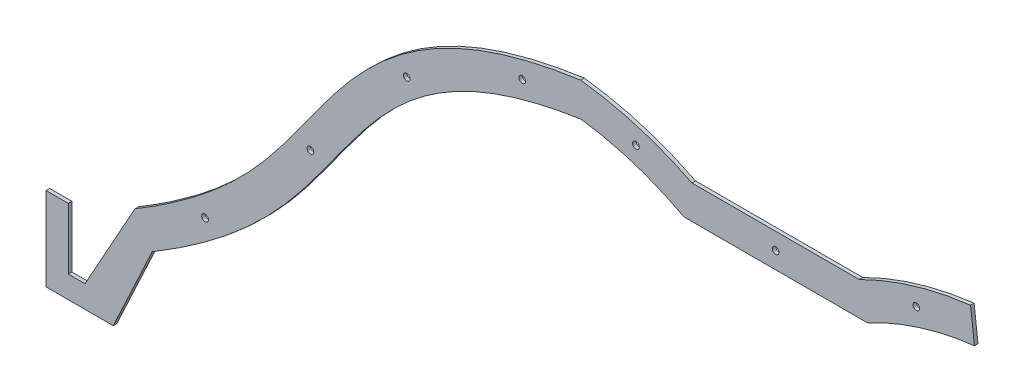
ISO-10303-21;
HEADER;
FILE_DESCRIPTION(('STEP AP214'),'2;1');
FILE_NAME('part.step','',(''),(''),'','','');
FILE_SCHEMA(('AUTOMOTIVE_DESIGN { 1 0 10303 214 1 1 1 1 }'));
ENDSEC;
DATA;
#1=APPLICATION_CONTEXT('core data for automotive mechanical design processes');
#2=APPLICATION_PROTOCOL_DEFINITION('international standard','automotive_design',2000,#1);
#3=PRODUCT_CONTEXT('',#1,'mechanical');
#4=PRODUCT('Part','Part','',(#3));
#5=PRODUCT_RELATED_PRODUCT_CATEGORY('part','',(#4));
#6=PRODUCT_DEFINITION_FORMATION('','',#4);
#7=PRODUCT_DEFINITION_CONTEXT('part definition',#1,'design');
#8=PRODUCT_DEFINITION('design','',#6,#7);
#9=PRODUCT_DEFINITION_SHAPE('','',#8);
#10=(LENGTH_UNIT() NAMED_UNIT(*) SI_UNIT(.MILLI.,.METRE.));
#11=(NAMED_UNIT(*) PLANE_ANGLE_UNIT() SI_UNIT($,.RADIAN.));
#12=(NAMED_UNIT(*) SI_UNIT($,.STERADIAN.) SOLID_ANGLE_UNIT());
#13=UNCERTAINTY_MEASURE_WITH_UNIT(LENGTH_MEASURE(1.E-05),#10,'distance_accuracy_value','');
#14=(GEOMETRIC_REPRESENTATION_CONTEXT(3) GLOBAL_UNCERTAINTY_ASSIGNED_CONTEXT((#13)) GLOBAL_UNIT_ASSIGNED_CONTEXT((#10,
#11,#12)) REPRESENTATION_CONTEXT('',''));
#15=CARTESIAN_POINT('',(0.,0.,0.));
#16=DIRECTION('',(0.,0.,1.));
#17=DIRECTION('',(1.,0.,0.));
#18=AXIS2_PLACEMENT_3D('',#15,#16,#17);
#19=CARTESIAN_POINT('',(-305.730376042937,66.0922491219474,3.175));
#20=DIRECTION('',(0.,0.,-1.));
#21=DIRECTION('',(-1.,0.,0.));
#22=AXIS2_PLACEMENT_3D('',#19,#20,#21);
#23=PLANE('',#22);
#24=CARTESIAN_POINT('',(226.311251147047,174.5053286279,3.175));
#25=DIRECTION('',(0.,0.,1.));
#26=DIRECTION('',(1.,0.,0.));
#27=AXIS2_PLACEMENT_3D('',#24,#25,#26);
#28=CIRCLE('',#27,2.99999999999999);
#29=CARTESIAN_POINT('',(229.311251147047,174.5053286279,3.175));
#30=VERTEX_POINT('',#29);
#31=EDGE_CURVE('E424',#30,#30,#28,.T.);
#32=ORIENTED_EDGE('',*,*,#31,.F.);
#33=EDGE_LOOP('',(#32));
#34=FACE_BOUND('',#33,.T.);
#35=CARTESIAN_POINT('',(-127.411512688745,174.255628939534,3.175));
#36=DIRECTION('',(0.,0.,1.));
#37=DIRECTION('',(1.,0.,0.));
#38=AXIS2_PLACEMENT_3D('',#35,#36,#37);
#39=CIRCLE('',#38,3.00000000000001);
#40=CARTESIAN_POINT('',(-124.411512688745,174.255628939534,3.175));
#41=VERTEX_POINT('',#40);
#42=EDGE_CURVE('E412',#41,#41,#39,.T.);
#43=ORIENTED_EDGE('',*,*,#42,.F.);
#44=EDGE_LOOP('',(#43));
#45=FACE_BOUND('',#44,.T.);
#46=CARTESIAN_POINT('',(-317.601811803088,24.2556289395343,3.175));
#47=DIRECTION('',(0.,0.,1.));
#48=DIRECTION('',(1.,0.,0.));
#49=AXIS2_PLACEMENT_3D('',#46,#47,#48);
#50=CIRCLE('',#49,2.99999999999999);
#51=CARTESIAN_POINT('',(-314.601811803088,24.2556289395343,3.175));
#52=VERTEX_POINT('',#51);
#53=EDGE_CURVE('E400',#52,#52,#50,.T.);
#54=ORIENTED_EDGE('',*,*,#53,.F.);
#55=EDGE_LOOP('',(#54));
#56=FACE_BOUND('',#55,.T.);
#57=CARTESIAN_POINT('',(-75.,200.,3.175));
#58=CARTESIAN_POINT('',(-257.635554762002,174.287094015671,3.175));
#59=CARTESIAN_POINT('',(-306.013905785091,34.0368017017092,3.175));
#60=CARTESIAN_POINT('',(-419.540575808605,-66.8200706837091,3.175));
#61=CARTESIAN_POINT('',(-475.,-100.,3.175));
#62=B_SPLINE_CURVE_WITH_KNOTS('',3,(#57,#58,#59,#60,#61),.UNSPECIFIED.,.F.,.F.,(4,1,4),(0.,
0.687776101030099,1.),.UNSPECIFIED.);
#63=CARTESIAN_POINT('',(-75.0000000000001,200.,3.175));
#64=VERTEX_POINT('',#63);
#65=CARTESIAN_POINT('',(-475.,-100.,3.175));
#66=VERTEX_POINT('',#65);
#67=EDGE_CURVE('E220',#64,#66,#62,.T.);
#68=ORIENTED_EDGE('',*,*,#67,.T.);
#69=DIRECTION('',(-0.48650906414586,-0.873675529303596,0.));
#70=VECTOR('',#69,1.);
#71=CARTESIAN_POINT('',(-519.962766017935,-180.744371060466,3.175));
#72=LINE('',#71,#70);
#73=CARTESIAN_POINT('',(-519.962766017935,-180.744371060466,3.175));
#74=VERTEX_POINT('',#73);
#75=EDGE_CURVE('E118',#66,#74,#72,.T.);
#76=ORIENTED_EDGE('',*,*,#75,.T.);
#77=DIRECTION('',(-1.,0.,0.));
#78=VECTOR('',#77,1.);
#79=CARTESIAN_POINT('',(-534.962766017935,-180.744371060466,3.175));
#80=LINE('',#79,#78);
#81=CARTESIAN_POINT('',(-534.962766017935,-180.744371060466,3.175));
#82=VERTEX_POINT('',#81);
#83=EDGE_CURVE('E259',#74,#82,#80,.T.);
#84=ORIENTED_EDGE('',*,*,#83,.T.);
#85=DIRECTION('',(0.,1.,0.));
#86=VECTOR('',#85,1.);
#87=CARTESIAN_POINT('',(-534.962766017935,-125.744371060466,3.175));
#88=LINE('',#87,#86);
#89=CARTESIAN_POINT('',(-534.962766017935,-125.744371060466,3.175));
#90=VERTEX_POINT('',#89);
#91=EDGE_CURVE('E278',#82,#90,#88,.T.);
#92=ORIENTED_EDGE('',*,*,#91,.T.);
#93=DIRECTION('',(-1.,0.,0.));
#94=VECTOR('',#93,1.);
#95=CARTESIAN_POINT('',(-554.962766017935,-125.744371060466,3.175));
#96=LINE('',#95,#94);
#97=CARTESIAN_POINT('',(-554.962766017935,-125.744371060466,3.175));
#98=VERTEX_POINT('',#97);
#99=EDGE_CURVE('E275',#90,#98,#96,.T.);
#100=ORIENTED_EDGE('',*,*,#99,.T.);
#101=DIRECTION('',(0.,-1.,0.));
#102=VECTOR('',#101,1.);
#103=CARTESIAN_POINT('',(-554.962766017935,-200.744371060466,3.175));
#104=LINE('',#103,#102);
#105=CARTESIAN_POINT('',(-554.962766017935,-200.744371060466,3.175));
#106=VERTEX_POINT('',#105);
#107=EDGE_CURVE('E277',#98,#106,#104,.T.);
#108=ORIENTED_EDGE('',*,*,#107,.T.);
#109=DIRECTION('',(1.,0.,0.));
#110=VECTOR('',#109,1.);
#111=CARTESIAN_POINT('',(-554.962766017935,-200.744371060466,3.175));
#112=LINE('',#111,#110);
#113=CARTESIAN_POINT('',(-494.597813184451,-200.744371060466,3.175));
#114=VERTEX_POINT('',#113);
#115=EDGE_CURVE('E280',#106,#114,#112,.T.);
#116=ORIENTED_EDGE('',*,*,#115,.T.);
#117=DIRECTION('',(0.422885465331124,0.906183139995265,0.));
#118=VECTOR('',#117,1.);
#119=CARTESIAN_POINT('',(-459.597813184451,-125.744371060466,3.175));
#120=LINE('',#119,#118);
#121=CARTESIAN_POINT('',(-459.597813184451,-125.744371060466,3.175));
#122=VERTEX_POINT('',#121);
#123=EDGE_CURVE('E286',#114,#122,#120,.T.);
#124=ORIENTED_EDGE('',*,*,#123,.T.);
#125=CARTESIAN_POINT('',(-459.597813184451,-125.744371060466,3.175));
#126=CARTESIAN_POINT('',(-458.167847661008,-124.888859924453,3.175));
#127=CARTESIAN_POINT('',(-455.300989910978,-123.160410803512,3.175));
#128=CARTESIAN_POINT('',(-449.693031194382,-119.725805066195,3.175));
#129=CARTESIAN_POINT('',(-442.844497858385,-115.430194442827,3.175));
#130=CARTESIAN_POINT('',(-434.897527212848,-110.280573748459,3.175));
#131=CARTESIAN_POINT('',(-424.643042918718,-103.410605597608,3.175));
#132=CARTESIAN_POINT('',(-412.446207366318,-94.8074073361384,3.175));
#133=CARTESIAN_POINT('',(-398.732866919874,-84.4254599712684,3.175));
#134=CARTESIAN_POINT('',(-385.875530013985,-73.9566558324273,3.175));
#135=CARTESIAN_POINT('',(-369.787206696001,-59.8500462059188,3.175));
#136=CARTESIAN_POINT('',(-355.152571956072,-45.4768028345298,3.175));
#137=CARTESIAN_POINT('',(-341.718077927236,-30.7847447708396,3.175));
#138=CARTESIAN_POINT('',(-332.160906415082,-19.5811865479318,3.175));
#139=CARTESIAN_POINT('',(-323.101555816333,-8.24103468343102,3.175));
#140=CARTESIAN_POINT('',(-311.63081691185,6.86364977739031,3.175));
#141=CARTESIAN_POINT('',(-298.117522757958,25.6059909159941,3.175));
#142=CARTESIAN_POINT('',(-282.395742384375,47.4315622052111,3.175));
#143=CARTESIAN_POINT('',(-266.384320483002,68.2509902397383,3.175));
#144=CARTESIAN_POINT('',(-249.341239770055,87.8033959609906,3.175));
#145=CARTESIAN_POINT('',(-230.504956306007,105.928130355789,3.175));
#146=CARTESIAN_POINT('',(-212.601243200538,119.77401821188,3.175));
#147=CARTESIAN_POINT('',(-196.457396920586,130.048920131079,3.175));
#148=CARTESIAN_POINT('',(-183.303935629058,137.332054250385,3.175));
#149=CARTESIAN_POINT('',(-168.969219752468,144.162376513778,3.175));
#150=CARTESIAN_POINT('',(-153.317967867507,150.500059010119,3.175));
#151=CARTESIAN_POINT('',(-136.218766866544,156.296597686252,3.175));
#152=CARTESIAN_POINT('',(-120.658812709166,160.629761276106,3.175));
#153=CARTESIAN_POINT('',(-107.364076992739,163.767973942765,3.175));
#154=CARTESIAN_POINT('',(-96.958515183911,165.949209965446,3.175));
#155=CARTESIAN_POINT('',(-87.9034354353759,167.618170458525,3.175));
#156=CARTESIAN_POINT('',(-80.4452519010201,168.856738215602,3.175));
#157=CARTESIAN_POINT('',(-76.6048102728115,169.448930821223,3.175));
#158=CARTESIAN_POINT('',(-74.6960572886801,169.732215312606,3.175));
#159=B_SPLINE_CURVE_WITH_KNOTS('',3,(#125,#126,#127,#128,#129,#130,#131,#132,#133,#134,#135,
#136,#137,#138,#139,#140,#141,#142,#143,#144,#145,#146,#147,#148,#149,#150,#151,#152,#153,#154,
#155,#156,#157,#158),.UNSPECIFIED.,.F.,.F.,(4,1,1,1,1,1,1,1,1,1,1,1,1,1,1,1,1,1,1,1,1,1,1,1,1,1,
1,1,1,1,1,4),(0.,0.00777204129202767,0.0155440825840553,0.0310881651681107,0.046632247752166,
0.0621763303362214,0.0932644955043321,0.124352660672443,0.155440825840553,0.186528991008664,
0.248705321344886,0.279793486512996,0.310881651681107,0.341969816849218,0.373057982017328,
0.43523431235355,0.497410642689771,0.559586973025993,0.621763303362214,0.683939633698435,
0.746115964034657,0.777204129202767,0.808292294370878,0.839380459538989,0.8704686247071,
0.90155678987521,0.932644955043321,0.948189037627376,0.963733120211432,0.979277202795487,
0.987049244087515,0.994821285379542),.UNSPECIFIED.);
#160=CARTESIAN_POINT('',(-74.6960572886801,169.732215312606,3.175));
#161=VERTEX_POINT('',#160);
#162=EDGE_CURVE('E288',#122,#161,#159,.T.);
#163=ORIENTED_EDGE('',*,*,#162,.T.);
#164=CARTESIAN_POINT('',(-109.889296501682,-97.9643216722729,3.175));
#165=DIRECTION('',(0.,0.,-1.));
#166=DIRECTION('',(-1.,0.,0.));
#167=AXIS2_PLACEMENT_3D('',#164,#165,#166);
#168=CIRCLE('',#167,270.);
#169=CARTESIAN_POINT('',(17.6763007847929,140.,3.175));
#170=VERTEX_POINT('',#169);
#171=EDGE_CURVE('E293',#161,#170,#168,.T.);
#172=ORIENTED_EDGE('',*,*,#171,.T.);
#173=DIRECTION('',(1.,0.,0.));
#174=VECTOR('',#173,1.);
#175=CARTESIAN_POINT('',(17.6763007847929,140.,3.175));
#176=LINE('',#175,#174);
#177=CARTESIAN_POINT('',(182.323699215207,140.,3.175));
#178=VERTEX_POINT('',#177);
#179=EDGE_CURVE('E374',#170,#178,#176,.T.);
#180=ORIENTED_EDGE('',*,*,#179,.T.);
#181=CARTESIAN_POINT('',(309.889296501682,-97.9643216722729,3.175));
#182=DIRECTION('',(0.,0.,-1.));
#183=DIRECTION('',(-1.,0.,0.));
#184=AXIS2_PLACEMENT_3D('',#181,#182,#183);
#185=CIRCLE('',#184,270.);
#186=CARTESIAN_POINT('',(278.488929650168,170.203567832773,3.175));
#187=VERTEX_POINT('',#186);
#188=EDGE_CURVE('E372',#178,#187,#185,.T.);
#189=ORIENTED_EDGE('',*,*,#188,.T.);
#190=DIRECTION('',(-0.116297655005604,0.993214405574243,0.));
#191=VECTOR('',#190,1.);
#192=CARTESIAN_POINT('',(278.488929650168,170.203567832773,3.175));
#193=LINE('',#192,#191);
#194=CARTESIAN_POINT('',(275.,200.,3.175));
#195=VERTEX_POINT('',#194);
#196=EDGE_CURVE('E161',#187,#195,#193,.T.);
#197=ORIENTED_EDGE('',*,*,#196,.T.);
#198=CARTESIAN_POINT('',(309.889296501682,-97.9643216722729,3.175));
#199=DIRECTION('',(0.,0.,1.));
#200=DIRECTION('',(-1.,0.,0.));
#201=AXIS2_PLACEMENT_3D('',#198,#199,#200);
#202=CIRCLE('',#201,300.);
#203=CARTESIAN_POINT('',(175.,170.,3.175));
#204=VERTEX_POINT('',#203);
#205=EDGE_CURVE('E155',#195,#204,#202,.T.);
#206=ORIENTED_EDGE('',*,*,#205,.T.);
#207=DIRECTION('',(-1.,0.,0.));
#208=VECTOR('',#207,1.);
#209=CARTESIAN_POINT('',(25.,170.,3.175));
#210=LINE('',#209,#208);
#211=CARTESIAN_POINT('',(25.,170.,3.175));
#212=VERTEX_POINT('',#211);
#213=EDGE_CURVE('E159',#204,#212,#210,.T.);
#214=ORIENTED_EDGE('',*,*,#213,.T.);
#215=CARTESIAN_POINT('',(-109.889296501682,-97.9643216722729,3.175));
#216=DIRECTION('',(0.,0.,1.));
#217=DIRECTION('',(-1.,0.,0.));
#218=AXIS2_PLACEMENT_3D('',#215,#216,#217);
#219=CIRCLE('',#218,300.);
#220=EDGE_CURVE('E51',#212,#64,#219,.T.);
#221=ORIENTED_EDGE('',*,*,#220,.T.);
#222=EDGE_LOOP('',(#68,#76,#84,#92,#100,#108,#116,#124,#163,#172,#180,#189,#197,#206,#214,#221));
#223=FACE_BOUND('',#222,.T.);
#224=CARTESIAN_POINT('',(-412.17449942756,-75.7443710604656,3.175));
#225=DIRECTION('',(0.,0.,1.));
#226=DIRECTION('',(1.,0.,0.));
#227=AXIS2_PLACEMENT_3D('',#224,#225,#226);
#228=CIRCLE('',#227,2.99999999999999);
#229=CARTESIAN_POINT('',(-409.17449942756,-75.7443710604656,3.175));
#230=VERTEX_POINT('',#229);
#231=EDGE_CURVE('E185',#230,#230,#228,.T.);
#232=ORIENTED_EDGE('',*,*,#231,.F.);
#233=EDGE_LOOP('',(#232));
#234=FACE_BOUND('',#233,.T.);
#235=CARTESIAN_POINT('',(-231.096695012499,124.255628939534,3.175));
#236=DIRECTION('',(0.,0.,1.));
#237=DIRECTION('',(1.,0.,0.));
#238=AXIS2_PLACEMENT_3D('',#235,#236,#237);
#239=CIRCLE('',#238,2.99999999999999);
#240=CARTESIAN_POINT('',(-228.096695012499,124.255628939534,3.175));
#241=VERTEX_POINT('',#240);
#242=EDGE_CURVE('E406',#241,#241,#239,.T.);
#243=ORIENTED_EDGE('',*,*,#242,.F.);
#244=EDGE_LOOP('',(#243));
#245=FACE_BOUND('',#244,.T.);
#246=CARTESIAN_POINT('',(100.,155.,3.175));
#247=DIRECTION('',(0.,0.,1.));
#248=DIRECTION('',(1.,0.,0.));
#249=AXIS2_PLACEMENT_3D('',#246,#247,#248);
#250=CIRCLE('',#249,3.00000000000001);
#251=CARTESIAN_POINT('',(103.,155.,3.175));
#252=VERTEX_POINT('',#251);
#253=EDGE_CURVE('E418',#252,#252,#250,.T.);
#254=ORIENTED_EDGE('',*,*,#253,.F.);
#255=EDGE_LOOP('',(#254));
#256=FACE_BOUND('',#255,.T.);
#257=CARTESIAN_POINT('',(-25.3925832180808,174.221837866137,3.175));
#258=DIRECTION('',(0.,0.,1.));
#259=DIRECTION('',(1.,0.,0.));
#260=AXIS2_PLACEMENT_3D('',#257,#258,#259);
#261=CIRCLE('',#260,3.);
#262=CARTESIAN_POINT('',(-22.3925832180808,174.221837866137,3.175));
#263=VERTEX_POINT('',#262);
#264=EDGE_CURVE('E430',#263,#263,#261,.T.);
#265=ORIENTED_EDGE('',*,*,#264,.F.);
#266=EDGE_LOOP('',(#265));
#267=FACE_BOUND('',#266,.T.);
#268=ADVANCED_FACE('F33',(#34,#45,#56,#223,#234,#245,#256,#267),#23,.F.);
#269=CARTESIAN_POINT('',(-305.730376042937,66.0922491219474,0.));
#270=DIRECTION('',(0.,0.,-1.));
#271=DIRECTION('',(-1.,0.,0.));
#272=AXIS2_PLACEMENT_3D('',#269,#270,#271);
#273=PLANE('',#272);
#274=CARTESIAN_POINT('',(226.311251147047,174.5053286279,0.));
#275=DIRECTION('',(0.,0.,1.));
#276=DIRECTION('',(1.,0.,0.));
#277=AXIS2_PLACEMENT_3D('',#274,#275,#276);
#278=CIRCLE('',#277,2.99999999999999);
#279=CARTESIAN_POINT('',(229.311251147047,174.5053286279,0.));
#280=VERTEX_POINT('',#279);
#281=EDGE_CURVE('E427',#280,#280,#278,.T.);
#282=ORIENTED_EDGE('',*,*,#281,.T.);
#283=EDGE_LOOP('',(#282));
#284=FACE_BOUND('',#283,.T.);
#285=CARTESIAN_POINT('',(-127.411512688745,174.255628939534,0.));
#286=DIRECTION('',(0.,0.,1.));
#287=DIRECTION('',(1.,0.,0.));
#288=AXIS2_PLACEMENT_3D('',#285,#286,#287);
#289=CIRCLE('',#288,3.00000000000001);
#290=CARTESIAN_POINT('',(-124.411512688745,174.255628939534,0.));
#291=VERTEX_POINT('',#290);
#292=EDGE_CURVE('E415',#291,#291,#289,.T.);
#293=ORIENTED_EDGE('',*,*,#292,.T.);
#294=EDGE_LOOP('',(#293));
#295=FACE_BOUND('',#294,.T.);
#296=CARTESIAN_POINT('',(-317.601811803088,24.2556289395343,0.));
#297=DIRECTION('',(0.,0.,1.));
#298=DIRECTION('',(1.,0.,0.));
#299=AXIS2_PLACEMENT_3D('',#296,#297,#298);
#300=CIRCLE('',#299,2.99999999999999);
#301=CARTESIAN_POINT('',(-314.601811803088,24.2556289395343,0.));
#302=VERTEX_POINT('',#301);
#303=EDGE_CURVE('E403',#302,#302,#300,.T.);
#304=ORIENTED_EDGE('',*,*,#303,.T.);
#305=EDGE_LOOP('',(#304));
#306=FACE_BOUND('',#305,.T.);
#307=CARTESIAN_POINT('',(-75.,200.,0.));
#308=CARTESIAN_POINT('',(-257.635554762002,174.287094015671,0.));
#309=CARTESIAN_POINT('',(-306.013905785091,34.0368017017092,0.));
#310=CARTESIAN_POINT('',(-419.540575808605,-66.8200706837091,0.));
#311=CARTESIAN_POINT('',(-475.,-100.,0.));
#312=B_SPLINE_CURVE_WITH_KNOTS('',3,(#307,#308,#309,#310,#311),.UNSPECIFIED.,.F.,.F.,(4,1,4),
(0.,0.687776101030099,1.),.UNSPECIFIED.);
#313=CARTESIAN_POINT('',(-75.0000000000001,200.,0.));
#314=VERTEX_POINT('',#313);
#315=CARTESIAN_POINT('',(-475.,-100.,0.));
#316=VERTEX_POINT('',#315);
#317=EDGE_CURVE('E179',#314,#316,#312,.T.);
#318=ORIENTED_EDGE('',*,*,#317,.F.);
#319=CARTESIAN_POINT('',(-109.889296501682,-97.9643216722729,0.));
#320=DIRECTION('',(0.,0.,1.));
#321=DIRECTION('',(-1.,0.,0.));
#322=AXIS2_PLACEMENT_3D('',#319,#320,#321);
#323=CIRCLE('',#322,300.);
#324=CARTESIAN_POINT('',(25.,170.,0.));
#325=VERTEX_POINT('',#324);
#326=EDGE_CURVE('E110',#325,#314,#323,.T.);
#327=ORIENTED_EDGE('',*,*,#326,.F.);
#328=DIRECTION('',(-1.,0.,0.));
#329=VECTOR('',#328,1.);
#330=CARTESIAN_POINT('',(25.,170.,0.));
#331=LINE('',#330,#329);
#332=CARTESIAN_POINT('',(175.,170.,0.));
#333=VERTEX_POINT('',#332);
#334=EDGE_CURVE('E104',#333,#325,#331,.T.);
#335=ORIENTED_EDGE('',*,*,#334,.F.);
#336=CARTESIAN_POINT('',(309.889296501682,-97.9643216722729,0.));
#337=DIRECTION('',(0.,0.,1.));
#338=DIRECTION('',(-1.,0.,0.));
#339=AXIS2_PLACEMENT_3D('',#336,#337,#338);
#340=CIRCLE('',#339,300.);
#341=CARTESIAN_POINT('',(275.,200.,0.));
#342=VERTEX_POINT('',#341);
#343=EDGE_CURVE('E169',#342,#333,#340,.T.);
#344=ORIENTED_EDGE('',*,*,#343,.F.);
#345=DIRECTION('',(-0.116297655005604,0.993214405574243,0.));
#346=VECTOR('',#345,1.);
#347=CARTESIAN_POINT('',(278.488929650168,170.203567832773,0.));
#348=LINE('',#347,#346);
#349=CARTESIAN_POINT('',(278.488929650168,170.203567832773,0.));
#350=VERTEX_POINT('',#349);
#351=EDGE_CURVE('E215',#350,#342,#348,.T.);
#352=ORIENTED_EDGE('',*,*,#351,.F.);
#353=CARTESIAN_POINT('',(309.889296501682,-97.9643216722729,0.));
#354=DIRECTION('',(0.,0.,-1.));
#355=DIRECTION('',(-1.,0.,0.));
#356=AXIS2_PLACEMENT_3D('',#353,#354,#355);
#357=CIRCLE('',#356,270.);
#358=CARTESIAN_POINT('',(182.323699215207,140.,0.));
#359=VERTEX_POINT('',#358);
#360=EDGE_CURVE('E213',#359,#350,#357,.T.);
#361=ORIENTED_EDGE('',*,*,#360,.F.);
#362=DIRECTION('',(1.,0.,0.));
#363=VECTOR('',#362,1.);
#364=CARTESIAN_POINT('',(17.6763007847929,140.,0.));
#365=LINE('',#364,#363);
#366=CARTESIAN_POINT('',(17.6763007847929,140.,0.));
#367=VERTEX_POINT('',#366);
#368=EDGE_CURVE('E211',#367,#359,#365,.T.);
#369=ORIENTED_EDGE('',*,*,#368,.F.);
#370=CARTESIAN_POINT('',(-109.889296501682,-97.9643216722729,0.));
#371=DIRECTION('',(0.,0.,-1.));
#372=DIRECTION('',(-1.,0.,0.));
#373=AXIS2_PLACEMENT_3D('',#370,#371,#372);
#374=CIRCLE('',#373,270.);
#375=CARTESIAN_POINT('',(-74.6960572886801,169.732215312606,0.));
#376=VERTEX_POINT('',#375);
#377=EDGE_CURVE('E206',#376,#367,#374,.T.);
#378=ORIENTED_EDGE('',*,*,#377,.F.);
#379=CARTESIAN_POINT('',(-459.597813184451,-125.744371060466,0.));
#380=CARTESIAN_POINT('',(-458.167847661008,-124.888859924453,0.));
#381=CARTESIAN_POINT('',(-455.300989910978,-123.160410803512,0.));
#382=CARTESIAN_POINT('',(-449.693031194382,-119.725805066195,0.));
#383=CARTESIAN_POINT('',(-442.844497858385,-115.430194442827,0.));
#384=CARTESIAN_POINT('',(-434.897527212848,-110.280573748459,0.));
#385=CARTESIAN_POINT('',(-424.643042918718,-103.410605597608,0.));
#386=CARTESIAN_POINT('',(-412.446207366318,-94.8074073361384,0.));
#387=CARTESIAN_POINT('',(-398.732866919874,-84.4254599712684,0.));
#388=CARTESIAN_POINT('',(-385.875530013985,-73.9566558324273,0.));
#389=CARTESIAN_POINT('',(-369.787206696001,-59.8500462059188,0.));
#390=CARTESIAN_POINT('',(-355.152571956072,-45.4768028345298,0.));
#391=CARTESIAN_POINT('',(-341.718077927236,-30.7847447708396,0.));
#392=CARTESIAN_POINT('',(-332.160906415082,-19.5811865479318,0.));
#393=CARTESIAN_POINT('',(-323.101555816333,-8.24103468343102,0.));
#394=CARTESIAN_POINT('',(-311.63081691185,6.86364977739031,0.));
#395=CARTESIAN_POINT('',(-298.117522757958,25.6059909159941,0.));
#396=CARTESIAN_POINT('',(-282.395742384375,47.4315622052111,0.));
#397=CARTESIAN_POINT('',(-266.384320483002,68.2509902397383,0.));
#398=CARTESIAN_POINT('',(-249.341239770055,87.8033959609906,0.));
#399=CARTESIAN_POINT('',(-230.504956306007,105.928130355789,0.));
#400=CARTESIAN_POINT('',(-212.601243200538,119.77401821188,0.));
#401=CARTESIAN_POINT('',(-196.457396920586,130.048920131079,0.));
#402=CARTESIAN_POINT('',(-183.303935629058,137.332054250385,0.));
#403=CARTESIAN_POINT('',(-168.969219752468,144.162376513778,0.));
#404=CARTESIAN_POINT('',(-153.317967867507,150.500059010119,0.));
#405=CARTESIAN_POINT('',(-136.218766866544,156.296597686252,0.));
#406=CARTESIAN_POINT('',(-120.658812709166,160.629761276106,0.));
#407=CARTESIAN_POINT('',(-107.364076992739,163.767973942765,0.));
#408=CARTESIAN_POINT('',(-96.958515183911,165.949209965446,0.));
#409=CARTESIAN_POINT('',(-87.9034354353759,167.618170458525,0.));
#410=CARTESIAN_POINT('',(-80.4452519010201,168.856738215602,0.));
#411=CARTESIAN_POINT('',(-76.6048102728115,169.448930821223,0.));
#412=CARTESIAN_POINT('',(-74.6960572886801,169.732215312606,0.));
#413=B_SPLINE_CURVE_WITH_KNOTS('',3,(#379,#380,#381,#382,#383,#384,#385,#386,#387,#388,#389,
#390,#391,#392,#393,#394,#395,#396,#397,#398,#399,#400,#401,#402,#403,#404,#405,#406,#407,#408,
#409,#410,#411,#412),.UNSPECIFIED.,.F.,.F.,(4,1,1,1,1,1,1,1,1,1,1,1,1,1,1,1,1,1,1,1,1,1,1,1,1,1,
1,1,1,1,1,4),(0.,0.00777204129202767,0.0155440825840553,0.0310881651681107,0.046632247752166,
0.0621763303362214,0.0932644955043321,0.124352660672443,0.155440825840553,0.186528991008664,
0.248705321344886,0.279793486512996,0.310881651681107,0.341969816849218,0.373057982017328,
0.43523431235355,0.497410642689771,0.559586973025993,0.621763303362214,0.683939633698435,
0.746115964034657,0.777204129202767,0.808292294370878,0.839380459538989,0.8704686247071,
0.90155678987521,0.932644955043321,0.948189037627376,0.963733120211432,0.979277202795487,
0.987049244087515,0.994821285379542),.UNSPECIFIED.);
#414=CARTESIAN_POINT('',(-459.597813184451,-125.744371060466,0.));
#415=VERTEX_POINT('',#414);
#416=EDGE_CURVE('E202',#415,#376,#413,.T.);
#417=ORIENTED_EDGE('',*,*,#416,.F.);
#418=DIRECTION('',(0.422885465331124,0.906183139995265,0.));
#419=VECTOR('',#418,1.);
#420=CARTESIAN_POINT('',(-459.597813184451,-125.744371060466,0.));
#421=LINE('',#420,#419);
#422=CARTESIAN_POINT('',(-494.597813184451,-200.744371060466,0.));
#423=VERTEX_POINT('',#422);
#424=EDGE_CURVE('E200',#423,#415,#421,.T.);
#425=ORIENTED_EDGE('',*,*,#424,.F.);
#426=DIRECTION('',(1.,0.,0.));
#427=VECTOR('',#426,1.);
#428=CARTESIAN_POINT('',(-554.962766017935,-200.744371060466,0.));
#429=LINE('',#428,#427);
#430=CARTESIAN_POINT('',(-554.962766017935,-200.744371060466,0.));
#431=VERTEX_POINT('',#430);
#432=EDGE_CURVE('E198',#431,#423,#429,.T.);
#433=ORIENTED_EDGE('',*,*,#432,.F.);
#434=DIRECTION('',(0.,-1.,0.));
#435=VECTOR('',#434,1.);
#436=CARTESIAN_POINT('',(-554.962766017935,-200.744371060466,0.));
#437=LINE('',#436,#435);
#438=CARTESIAN_POINT('',(-554.962766017935,-125.744371060466,0.));
#439=VERTEX_POINT('',#438);
#440=EDGE_CURVE('E196',#439,#431,#437,.T.);
#441=ORIENTED_EDGE('',*,*,#440,.F.);
#442=DIRECTION('',(-1.,0.,0.));
#443=VECTOR('',#442,1.);
#444=CARTESIAN_POINT('',(-554.962766017935,-125.744371060466,0.));
#445=LINE('',#444,#443);
#446=CARTESIAN_POINT('',(-534.962766017935,-125.744371060466,0.));
#447=VERTEX_POINT('',#446);
#448=EDGE_CURVE('E194',#447,#439,#445,.T.);
#449=ORIENTED_EDGE('',*,*,#448,.F.);
#450=DIRECTION('',(0.,1.,0.));
#451=VECTOR('',#450,1.);
#452=CARTESIAN_POINT('',(-534.962766017935,-125.744371060466,0.));
#453=LINE('',#452,#451);
#454=CARTESIAN_POINT('',(-534.962766017935,-180.744371060466,0.));
#455=VERTEX_POINT('',#454);
#456=EDGE_CURVE('E192',#455,#447,#453,.T.);
#457=ORIENTED_EDGE('',*,*,#456,.F.);
#458=DIRECTION('',(-1.,0.,0.));
#459=VECTOR('',#458,1.);
#460=CARTESIAN_POINT('',(-534.962766017935,-180.744371060466,0.));
#461=LINE('',#460,#459);
#462=CARTESIAN_POINT('',(-519.962766017935,-180.744371060466,0.));
#463=VERTEX_POINT('',#462);
#464=EDGE_CURVE('E190',#463,#455,#461,.T.);
#465=ORIENTED_EDGE('',*,*,#464,.F.);
#466=DIRECTION('',(-0.48650906414586,-0.873675529303596,0.));
#467=VECTOR('',#466,1.);
#468=CARTESIAN_POINT('',(-519.962766017935,-180.744371060466,0.));
#469=LINE('',#468,#467);
#470=EDGE_CURVE('E184',#316,#463,#469,.T.);
#471=ORIENTED_EDGE('',*,*,#470,.F.);
#472=EDGE_LOOP('',(#318,#327,#335,#344,#352,#361,#369,#378,#417,#425,#433,#441,#449,#457,#465,#471));
#473=FACE_BOUND('',#472,.T.);
#474=CARTESIAN_POINT('',(-412.17449942756,-75.7443710604656,0.));
#475=DIRECTION('',(0.,0.,1.));
#476=DIRECTION('',(1.,0.,0.));
#477=AXIS2_PLACEMENT_3D('',#474,#475,#476);
#478=CIRCLE('',#477,2.99999999999999);
#479=CARTESIAN_POINT('',(-409.17449942756,-75.7443710604656,0.));
#480=VERTEX_POINT('',#479);
#481=EDGE_CURVE('E394',#480,#480,#478,.T.);
#482=ORIENTED_EDGE('',*,*,#481,.T.);
#483=EDGE_LOOP('',(#482));
#484=FACE_BOUND('',#483,.T.);
#485=CARTESIAN_POINT('',(-231.096695012499,124.255628939534,0.));
#486=DIRECTION('',(0.,0.,1.));
#487=DIRECTION('',(1.,0.,0.));
#488=AXIS2_PLACEMENT_3D('',#485,#486,#487);
#489=CIRCLE('',#488,2.99999999999999);
#490=CARTESIAN_POINT('',(-228.096695012499,124.255628939534,0.));
#491=VERTEX_POINT('',#490);
#492=EDGE_CURVE('E409',#491,#491,#489,.T.);
#493=ORIENTED_EDGE('',*,*,#492,.T.);
#494=EDGE_LOOP('',(#493));
#495=FACE_BOUND('',#494,.T.);
#496=CARTESIAN_POINT('',(100.,155.,0.));
#497=DIRECTION('',(0.,0.,1.));
#498=DIRECTION('',(1.,0.,0.));
#499=AXIS2_PLACEMENT_3D('',#496,#497,#498);
#500=CIRCLE('',#499,3.00000000000001);
#501=CARTESIAN_POINT('',(103.,155.,0.));
#502=VERTEX_POINT('',#501);
#503=EDGE_CURVE('E421',#502,#502,#500,.T.);
#504=ORIENTED_EDGE('',*,*,#503,.T.);
#505=EDGE_LOOP('',(#504));
#506=FACE_BOUND('',#505,.T.);
#507=CARTESIAN_POINT('',(-25.3925832180808,174.221837866137,0.));
#508=DIRECTION('',(0.,0.,1.));
#509=DIRECTION('',(1.,0.,0.));
#510=AXIS2_PLACEMENT_3D('',#507,#508,#509);
#511=CIRCLE('',#510,3.);
#512=CARTESIAN_POINT('',(-22.3925832180808,174.221837866137,0.));
#513=VERTEX_POINT('',#512);
#514=EDGE_CURVE('E433',#513,#513,#511,.T.);
#515=ORIENTED_EDGE('',*,*,#514,.T.);
#516=EDGE_LOOP('',(#515));
#517=FACE_BOUND('',#516,.T.);
#518=ADVANCED_FACE('F263',(#284,#295,#306,#473,#484,#495,#506,#517),#273,.T.);
#519=DIRECTION('',(0.,0.,-1.));
#520=VECTOR('',#519,1.);
#521=SURFACE_OF_LINEAR_EXTRUSION('',#62,#520);
#522=ORIENTED_EDGE('',*,*,#317,.T.);
#523=DIRECTION('',(0.,0.,-1.));
#524=VECTOR('',#523,1.);
#525=CARTESIAN_POINT('',(-475.,-100.,3.175));
#526=LINE('',#525,#524);
#527=EDGE_CURVE('E11',#66,#316,#526,.T.);
#528=ORIENTED_EDGE('',*,*,#527,.F.);
#529=ORIENTED_EDGE('',*,*,#67,.F.);
#530=DIRECTION('',(0.,0.,-1.));
#531=VECTOR('',#530,1.);
#532=CARTESIAN_POINT('',(-75.0000000000001,200.,3.175));
#533=LINE('',#532,#531);
#534=EDGE_CURVE('E175',#64,#314,#533,.T.);
#535=ORIENTED_EDGE('',*,*,#534,.T.);
#536=EDGE_LOOP('',(#522,#528,#529,#535));
#537=FACE_BOUND('',#536,.T.);
#538=ADVANCED_FACE('F35',(#537),#521,.F.);
#539=CARTESIAN_POINT('',(-519.962766017935,-180.744371060466,3.175));
#540=DIRECTION('',(0.873675529303596,-0.48650906414586,0.));
#541=DIRECTION('',(0.48650906414586,0.873675529303596,0.));
#542=AXIS2_PLACEMENT_3D('',#539,#540,#541);
#543=PLANE('',#542);
#544=ORIENTED_EDGE('',*,*,#470,.T.);
#545=DIRECTION('',(0.,0.,-1.));
#546=VECTOR('',#545,1.);
#547=CARTESIAN_POINT('',(-519.962766017935,-180.744371060466,3.175));
#548=LINE('',#547,#546);
#549=EDGE_CURVE('E43',#74,#463,#548,.T.);
#550=ORIENTED_EDGE('',*,*,#549,.F.);
#551=ORIENTED_EDGE('',*,*,#75,.F.);
#552=ORIENTED_EDGE('',*,*,#527,.T.);
#553=EDGE_LOOP('',(#544,#550,#551,#552));
#554=FACE_BOUND('',#553,.T.);
#555=ADVANCED_FACE('F323',(#554),#543,.F.);
#556=CARTESIAN_POINT('',(-534.962766017935,-180.744371060466,3.175));
#557=DIRECTION('',(0.,-1.,0.));
#558=DIRECTION('',(0.,0.,-1.));
#559=AXIS2_PLACEMENT_3D('',#556,#557,#558);
#560=PLANE('',#559);
#561=ORIENTED_EDGE('',*,*,#464,.T.);
#562=DIRECTION('',(0.,0.,-1.));
#563=VECTOR('',#562,1.);
#564=CARTESIAN_POINT('',(-534.962766017935,-180.744371060466,3.175));
#565=LINE('',#564,#563);
#566=EDGE_CURVE('E251',#82,#455,#565,.T.);
#567=ORIENTED_EDGE('',*,*,#566,.F.);
#568=ORIENTED_EDGE('',*,*,#83,.F.);
#569=ORIENTED_EDGE('',*,*,#549,.T.);
#570=EDGE_LOOP('',(#561,#567,#568,#569));
#571=FACE_BOUND('',#570,.T.);
#572=ADVANCED_FACE('F257',(#571),#560,.F.);
#573=CARTESIAN_POINT('',(-534.962766017935,-125.744371060466,3.175));
#574=DIRECTION('',(-1.,0.,0.));
#575=DIRECTION('',(0.,0.,1.));
#576=AXIS2_PLACEMENT_3D('',#573,#574,#575);
#577=PLANE('',#576);
#578=ORIENTED_EDGE('',*,*,#456,.T.);
#579=DIRECTION('',(0.,0.,-1.));
#580=VECTOR('',#579,1.);
#581=CARTESIAN_POINT('',(-534.962766017935,-125.744371060466,3.175));
#582=LINE('',#581,#580);
#583=EDGE_CURVE('E248',#90,#447,#582,.T.);
#584=ORIENTED_EDGE('',*,*,#583,.F.);
#585=ORIENTED_EDGE('',*,*,#91,.F.);
#586=ORIENTED_EDGE('',*,*,#566,.T.);
#587=EDGE_LOOP('',(#578,#584,#585,#586));
#588=FACE_BOUND('',#587,.T.);
#589=ADVANCED_FACE('F269',(#588),#577,.F.);
#590=CARTESIAN_POINT('',(-554.962766017935,-125.744371060466,3.175));
#591=DIRECTION('',(0.,-1.,0.));
#592=DIRECTION('',(0.,0.,-1.));
#593=AXIS2_PLACEMENT_3D('',#590,#591,#592);
#594=PLANE('',#593);
#595=ORIENTED_EDGE('',*,*,#448,.T.);
#596=DIRECTION('',(0.,0.,-1.));
#597=VECTOR('',#596,1.);
#598=CARTESIAN_POINT('',(-554.962766017935,-125.744371060466,3.175));
#599=LINE('',#598,#597);
#600=EDGE_CURVE('E245',#98,#439,#599,.T.);
#601=ORIENTED_EDGE('',*,*,#600,.F.);
#602=ORIENTED_EDGE('',*,*,#99,.F.);
#603=ORIENTED_EDGE('',*,*,#583,.T.);
#604=EDGE_LOOP('',(#595,#601,#602,#603));
#605=FACE_BOUND('',#604,.T.);
#606=ADVANCED_FACE('F273',(#605),#594,.F.);
#607=CARTESIAN_POINT('',(-554.962766017935,-200.744371060466,3.175));
#608=DIRECTION('',(1.,0.,0.));
#609=DIRECTION('',(0.,0.,-1.));
#610=AXIS2_PLACEMENT_3D('',#607,#608,#609);
#611=PLANE('',#610);
#612=ORIENTED_EDGE('',*,*,#440,.T.);
#613=DIRECTION('',(0.,0.,-1.));
#614=VECTOR('',#613,1.);
#615=CARTESIAN_POINT('',(-554.962766017935,-200.744371060466,3.175));
#616=LINE('',#615,#614);
#617=EDGE_CURVE('E242',#106,#431,#616,.T.);
#618=ORIENTED_EDGE('',*,*,#617,.F.);
#619=ORIENTED_EDGE('',*,*,#107,.F.);
#620=ORIENTED_EDGE('',*,*,#600,.T.);
#621=EDGE_LOOP('',(#612,#618,#619,#620));
#622=FACE_BOUND('',#621,.T.);
#623=ADVANCED_FACE('F313',(#622),#611,.F.);
#624=CARTESIAN_POINT('',(-554.962766017935,-200.744371060466,3.175));
#625=DIRECTION('',(0.,1.,0.));
#626=DIRECTION('',(0.,0.,1.));
#627=AXIS2_PLACEMENT_3D('',#624,#625,#626);
#628=PLANE('',#627);
#629=ORIENTED_EDGE('',*,*,#432,.T.);
#630=DIRECTION('',(0.,0.,-1.));
#631=VECTOR('',#630,1.);
#632=CARTESIAN_POINT('',(-494.597813184451,-200.744371060466,3.175));
#633=LINE('',#632,#631);
#634=EDGE_CURVE('E239',#114,#423,#633,.T.);
#635=ORIENTED_EDGE('',*,*,#634,.F.);
#636=ORIENTED_EDGE('',*,*,#115,.F.);
#637=ORIENTED_EDGE('',*,*,#617,.T.);
#638=EDGE_LOOP('',(#629,#635,#636,#637));
#639=FACE_BOUND('',#638,.T.);
#640=ADVANCED_FACE('F309',(#639),#628,.F.);
#641=CARTESIAN_POINT('',(-459.597813184451,-125.744371060466,3.175));
#642=DIRECTION('',(-0.906183139995265,0.422885465331124,0.));
#643=DIRECTION('',(-0.422885465331124,-0.906183139995265,0.));
#644=AXIS2_PLACEMENT_3D('',#641,#642,#643);
#645=PLANE('',#644);
#646=ORIENTED_EDGE('',*,*,#424,.T.);
#647=DIRECTION('',(0.,0.,-1.));
#648=VECTOR('',#647,1.);
#649=CARTESIAN_POINT('',(-459.597813184451,-125.744371060466,3.175));
#650=LINE('',#649,#648);
#651=EDGE_CURVE('E236',#122,#415,#650,.T.);
#652=ORIENTED_EDGE('',*,*,#651,.F.);
#653=ORIENTED_EDGE('',*,*,#123,.F.);
#654=ORIENTED_EDGE('',*,*,#634,.T.);
#655=EDGE_LOOP('',(#646,#652,#653,#654));
#656=FACE_BOUND('',#655,.T.);
#657=ADVANCED_FACE('F304',(#656),#645,.F.);
#658=DIRECTION('',(0.,0.,-1.));
#659=VECTOR('',#658,1.);
#660=SURFACE_OF_LINEAR_EXTRUSION('',#159,#659);
#661=ORIENTED_EDGE('',*,*,#416,.T.);
#662=DIRECTION('',(0.,0.,-1.));
#663=VECTOR('',#662,1.);
#664=CARTESIAN_POINT('',(-74.6960572886801,169.732215312606,3.175));
#665=LINE('',#664,#663);
#666=EDGE_CURVE('E233',#161,#376,#665,.T.);
#667=ORIENTED_EDGE('',*,*,#666,.F.);
#668=ORIENTED_EDGE('',*,*,#162,.F.);
#669=ORIENTED_EDGE('',*,*,#651,.T.);
#670=EDGE_LOOP('',(#661,#667,#668,#669));
#671=FACE_BOUND('',#670,.T.);
#672=ADVANCED_FACE('F299',(#671),#660,.F.);
#673=CARTESIAN_POINT('',(-109.889296501682,-97.9643216722729,3.175));
#674=DIRECTION('',(0.,0.,-1.));
#675=DIRECTION('',(-1.,0.,0.));
#676=AXIS2_PLACEMENT_3D('',#673,#674,#675);
#677=CYLINDRICAL_SURFACE('',#676,270.);
#678=ORIENTED_EDGE('',*,*,#377,.T.);
#679=DIRECTION('',(0.,0.,-1.));
#680=VECTOR('',#679,1.);
#681=CARTESIAN_POINT('',(17.6763007847929,140.,3.175));
#682=LINE('',#681,#680);
#683=EDGE_CURVE('E230',#170,#367,#682,.T.);
#684=ORIENTED_EDGE('',*,*,#683,.F.);
#685=ORIENTED_EDGE('',*,*,#171,.F.);
#686=ORIENTED_EDGE('',*,*,#666,.T.);
#687=EDGE_LOOP('',(#678,#684,#685,#686));
#688=FACE_BOUND('',#687,.T.);
#689=ADVANCED_FACE('F303',(#688),#677,.F.);
#690=CARTESIAN_POINT('',(17.6763007847929,140.,3.175));
#691=DIRECTION('',(0.,1.,0.));
#692=DIRECTION('',(0.,0.,1.));
#693=AXIS2_PLACEMENT_3D('',#690,#691,#692);
#694=PLANE('',#693);
#695=ORIENTED_EDGE('',*,*,#368,.T.);
#696=DIRECTION('',(0.,0.,-1.));
#697=VECTOR('',#696,1.);
#698=CARTESIAN_POINT('',(182.323699215207,140.,3.175));
#699=LINE('',#698,#697);
#700=EDGE_CURVE('E227',#178,#359,#699,.T.);
#701=ORIENTED_EDGE('',*,*,#700,.F.);
#702=ORIENTED_EDGE('',*,*,#179,.F.);
#703=ORIENTED_EDGE('',*,*,#683,.T.);
#704=EDGE_LOOP('',(#695,#701,#702,#703));
#705=FACE_BOUND('',#704,.T.);
#706=ADVANCED_FACE('F356',(#705),#694,.F.);
#707=CARTESIAN_POINT('',(309.889296501682,-97.9643216722729,3.175));
#708=DIRECTION('',(0.,0.,-1.));
#709=DIRECTION('',(-1.,0.,0.));
#710=AXIS2_PLACEMENT_3D('',#707,#708,#709);
#711=CYLINDRICAL_SURFACE('',#710,270.);
#712=ORIENTED_EDGE('',*,*,#360,.T.);
#713=DIRECTION('',(0.,0.,-1.));
#714=VECTOR('',#713,1.);
#715=CARTESIAN_POINT('',(278.488929650168,170.203567832773,3.175));
#716=LINE('',#715,#714);
#717=EDGE_CURVE('E224',#187,#350,#716,.T.);
#718=ORIENTED_EDGE('',*,*,#717,.F.);
#719=ORIENTED_EDGE('',*,*,#188,.F.);
#720=ORIENTED_EDGE('',*,*,#700,.T.);
#721=EDGE_LOOP('',(#712,#718,#719,#720));
#722=FACE_BOUND('',#721,.T.);
#723=ADVANCED_FACE('F353',(#722),#711,.F.);
#724=CARTESIAN_POINT('',(278.488929650168,170.203567832773,3.175));
#725=DIRECTION('',(-0.993214405574243,-0.116297655005604,0.));
#726=DIRECTION('',(0.116297655005604,-0.993214405574243,0.));
#727=AXIS2_PLACEMENT_3D('',#724,#725,#726);
#728=PLANE('',#727);
#729=ORIENTED_EDGE('',*,*,#351,.T.);
#730=DIRECTION('',(0.,0.,-1.));
#731=VECTOR('',#730,1.);
#732=CARTESIAN_POINT('',(275.,200.,3.175));
#733=LINE('',#732,#731);
#734=EDGE_CURVE('E170',#195,#342,#733,.T.);
#735=ORIENTED_EDGE('',*,*,#734,.F.);
#736=ORIENTED_EDGE('',*,*,#196,.F.);
#737=ORIENTED_EDGE('',*,*,#717,.T.);
#738=EDGE_LOOP('',(#729,#735,#736,#737));
#739=FACE_BOUND('',#738,.T.);
#740=ADVANCED_FACE('F350',(#739),#728,.F.);
#741=CARTESIAN_POINT('',(309.889296501682,-97.9643216722729,3.175));
#742=DIRECTION('',(0.,0.,-1.));
#743=DIRECTION('',(-1.,0.,0.));
#744=AXIS2_PLACEMENT_3D('',#741,#742,#743);
#745=CYLINDRICAL_SURFACE('',#744,300.);
#746=ORIENTED_EDGE('',*,*,#343,.T.);
#747=DIRECTION('',(0.,0.,-1.));
#748=VECTOR('',#747,1.);
#749=CARTESIAN_POINT('',(175.,170.,3.175));
#750=LINE('',#749,#748);
#751=EDGE_CURVE('E166',#204,#333,#750,.T.);
#752=ORIENTED_EDGE('',*,*,#751,.F.);
#753=ORIENTED_EDGE('',*,*,#205,.F.);
#754=ORIENTED_EDGE('',*,*,#734,.T.);
#755=EDGE_LOOP('',(#746,#752,#753,#754));
#756=FACE_BOUND('',#755,.T.);
#757=ADVANCED_FACE('F167',(#756),#745,.T.);
#758=CARTESIAN_POINT('',(25.,170.,3.175));
#759=DIRECTION('',(0.,-1.,0.));
#760=DIRECTION('',(0.,0.,-1.));
#761=AXIS2_PLACEMENT_3D('',#758,#759,#760);
#762=PLANE('',#761);
#763=ORIENTED_EDGE('',*,*,#334,.T.);
#764=DIRECTION('',(0.,0.,-1.));
#765=VECTOR('',#764,1.);
#766=CARTESIAN_POINT('',(25.,170.,3.175));
#767=LINE('',#766,#765);
#768=EDGE_CURVE('E171',#212,#325,#767,.T.);
#769=ORIENTED_EDGE('',*,*,#768,.F.);
#770=ORIENTED_EDGE('',*,*,#213,.F.);
#771=ORIENTED_EDGE('',*,*,#751,.T.);
#772=EDGE_LOOP('',(#763,#769,#770,#771));
#773=FACE_BOUND('',#772,.T.);
#774=ADVANCED_FACE('F173',(#773),#762,.F.);
#775=CARTESIAN_POINT('',(-109.889296501682,-97.9643216722729,3.175));
#776=DIRECTION('',(0.,0.,-1.));
#777=DIRECTION('',(-1.,0.,0.));
#778=AXIS2_PLACEMENT_3D('',#775,#776,#777);
#779=CYLINDRICAL_SURFACE('',#778,300.);
#780=ORIENTED_EDGE('',*,*,#326,.T.);
#781=ORIENTED_EDGE('',*,*,#534,.F.);
#782=ORIENTED_EDGE('',*,*,#220,.F.);
#783=ORIENTED_EDGE('',*,*,#768,.T.);
#784=EDGE_LOOP('',(#780,#781,#782,#783));
#785=FACE_BOUND('',#784,.T.);
#786=ADVANCED_FACE('F343',(#785),#779,.T.);
#787=CARTESIAN_POINT('',(-412.17449942756,-75.7443710604656,3.175));
#788=DIRECTION('',(0.,0.,-1.));
#789=DIRECTION('',(-1.,0.,0.));
#790=AXIS2_PLACEMENT_3D('',#787,#788,#789);
#791=CYLINDRICAL_SURFACE('',#790,2.99999999999999);
#792=ORIENTED_EDGE('',*,*,#231,.T.);
#793=EDGE_LOOP('',(#792));
#794=FACE_BOUND('',#793,.T.);
#795=ORIENTED_EDGE('',*,*,#481,.F.);
#796=EDGE_LOOP('',(#795));
#797=FACE_BOUND('',#796,.T.);
#798=ADVANCED_FACE('F340',(#794,#797),#791,.F.);
#799=CARTESIAN_POINT('',(-317.601811803088,24.2556289395343,3.175));
#800=DIRECTION('',(0.,0.,-1.));
#801=DIRECTION('',(-1.,0.,0.));
#802=AXIS2_PLACEMENT_3D('',#799,#800,#801);
#803=CYLINDRICAL_SURFACE('',#802,2.99999999999999);
#804=ORIENTED_EDGE('',*,*,#53,.T.);
#805=EDGE_LOOP('',(#804));
#806=FACE_BOUND('',#805,.T.);
#807=ORIENTED_EDGE('',*,*,#303,.F.);
#808=EDGE_LOOP('',(#807));
#809=FACE_BOUND('',#808,.T.);
#810=ADVANCED_FACE('F463',(#806,#809),#803,.F.);
#811=CARTESIAN_POINT('',(-231.096695012499,124.255628939534,3.175));
#812=DIRECTION('',(0.,0.,-1.));
#813=DIRECTION('',(-1.,0.,0.));
#814=AXIS2_PLACEMENT_3D('',#811,#812,#813);
#815=CYLINDRICAL_SURFACE('',#814,2.99999999999999);
#816=ORIENTED_EDGE('',*,*,#242,.T.);
#817=EDGE_LOOP('',(#816));
#818=FACE_BOUND('',#817,.T.);
#819=ORIENTED_EDGE('',*,*,#492,.F.);
#820=EDGE_LOOP('',(#819));
#821=FACE_BOUND('',#820,.T.);
#822=ADVANCED_FACE('F460',(#818,#821),#815,.F.);
#823=CARTESIAN_POINT('',(-127.411512688745,174.255628939534,3.175));
#824=DIRECTION('',(0.,0.,-1.));
#825=DIRECTION('',(-1.,0.,0.));
#826=AXIS2_PLACEMENT_3D('',#823,#824,#825);
#827=CYLINDRICAL_SURFACE('',#826,3.00000000000001);
#828=ORIENTED_EDGE('',*,*,#42,.T.);
#829=EDGE_LOOP('',(#828));
#830=FACE_BOUND('',#829,.T.);
#831=ORIENTED_EDGE('',*,*,#292,.F.);
#832=EDGE_LOOP('',(#831));
#833=FACE_BOUND('',#832,.T.);
#834=ADVANCED_FACE('F456',(#830,#833),#827,.F.);
#835=CARTESIAN_POINT('',(100.,155.,3.175));
#836=DIRECTION('',(0.,0.,-1.));
#837=DIRECTION('',(-1.,0.,0.));
#838=AXIS2_PLACEMENT_3D('',#835,#836,#837);
#839=CYLINDRICAL_SURFACE('',#838,3.00000000000001);
#840=ORIENTED_EDGE('',*,*,#253,.T.);
#841=EDGE_LOOP('',(#840));
#842=FACE_BOUND('',#841,.T.);
#843=ORIENTED_EDGE('',*,*,#503,.F.);
#844=EDGE_LOOP('',(#843));
#845=FACE_BOUND('',#844,.T.);
#846=ADVANCED_FACE('F450',(#842,#845),#839,.F.);
#847=CARTESIAN_POINT('',(226.311251147047,174.5053286279,3.175));
#848=DIRECTION('',(0.,0.,-1.));
#849=DIRECTION('',(-1.,0.,0.));
#850=AXIS2_PLACEMENT_3D('',#847,#848,#849);
#851=CYLINDRICAL_SURFACE('',#850,2.99999999999999);
#852=ORIENTED_EDGE('',*,*,#31,.T.);
#853=EDGE_LOOP('',(#852));
#854=FACE_BOUND('',#853,.T.);
#855=ORIENTED_EDGE('',*,*,#281,.F.);
#856=EDGE_LOOP('',(#855));
#857=FACE_BOUND('',#856,.T.);
#858=ADVANCED_FACE('F443',(#854,#857),#851,.F.);
#859=CARTESIAN_POINT('',(-25.3925832180808,174.221837866137,3.175));
#860=DIRECTION('',(0.,0.,-1.));
#861=DIRECTION('',(-1.,0.,0.));
#862=AXIS2_PLACEMENT_3D('',#859,#860,#861);
#863=CYLINDRICAL_SURFACE('',#862,3.);
#864=ORIENTED_EDGE('',*,*,#264,.T.);
#865=EDGE_LOOP('',(#864));
#866=FACE_BOUND('',#865,.T.);
#867=ORIENTED_EDGE('',*,*,#514,.F.);
#868=EDGE_LOOP('',(#867));
#869=FACE_BOUND('',#868,.T.);
#870=ADVANCED_FACE('F439',(#866,#869),#863,.F.);
#871=CLOSED_SHELL('',(#268,#518,#538,#555,#572,#589,#606,#623,#640,#657,#672,#689,#706,#723,
#740,#757,#774,#786,#798,#810,#822,#834,#846,#858,#870));
#872=MANIFOLD_SOLID_BREP('B2',#871);
#873=ADVANCED_BREP_SHAPE_REPRESENTATION('',(#18,#872),#14);
#874=SHAPE_DEFINITION_REPRESENTATION(#9,#873);
ENDSEC;
END-ISO-10303-21;
